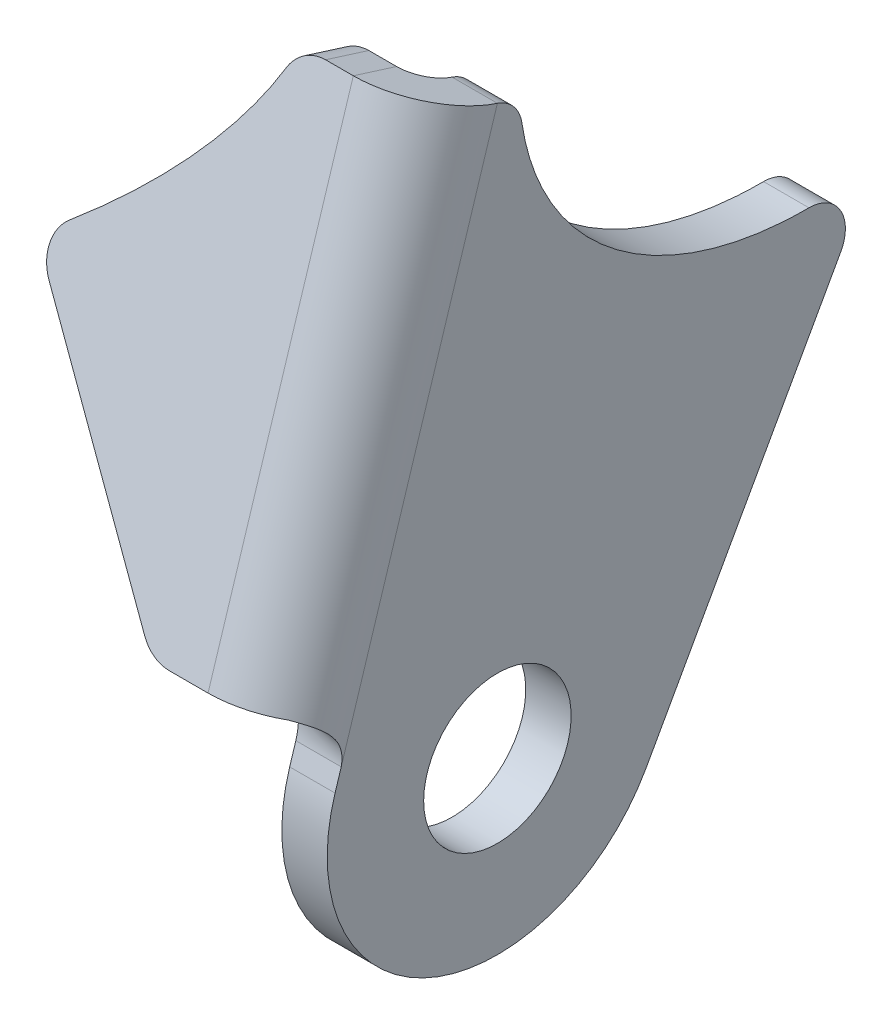
ISO-10303-21;
HEADER;
FILE_DESCRIPTION(('STEP AP214'),'2;1');
FILE_NAME('part.step','',(''),(''),'','','');
FILE_SCHEMA(('AUTOMOTIVE_DESIGN { 1 0 10303 214 1 1 1 1 }'));
ENDSEC;
DATA;
#1=APPLICATION_CONTEXT('core data for automotive mechanical design processes');
#2=APPLICATION_PROTOCOL_DEFINITION('international standard','automotive_design',2000,#1);
#3=PRODUCT_CONTEXT('',#1,'mechanical');
#4=PRODUCT('Part','Part','',(#3));
#5=PRODUCT_RELATED_PRODUCT_CATEGORY('part','',(#4));
#6=PRODUCT_DEFINITION_FORMATION('','',#4);
#7=PRODUCT_DEFINITION_CONTEXT('part definition',#1,'design');
#8=PRODUCT_DEFINITION('design','',#6,#7);
#9=PRODUCT_DEFINITION_SHAPE('','',#8);
#10=(LENGTH_UNIT() NAMED_UNIT(*) SI_UNIT(.MILLI.,.METRE.));
#11=(NAMED_UNIT(*) PLANE_ANGLE_UNIT() SI_UNIT($,.RADIAN.));
#12=(NAMED_UNIT(*) SI_UNIT($,.STERADIAN.) SOLID_ANGLE_UNIT());
#13=UNCERTAINTY_MEASURE_WITH_UNIT(LENGTH_MEASURE(1.E-05),#10,'distance_accuracy_value','');
#14=(GEOMETRIC_REPRESENTATION_CONTEXT(3) GLOBAL_UNCERTAINTY_ASSIGNED_CONTEXT((#13)) GLOBAL_UNIT_ASSIGNED_CONTEXT((#10,
#11,#12)) REPRESENTATION_CONTEXT('',''));
#15=CARTESIAN_POINT('',(0.,0.,0.));
#16=DIRECTION('',(0.,0.,1.));
#17=DIRECTION('',(1.,0.,0.));
#18=AXIS2_PLACEMENT_3D('',#15,#16,#17);
#19=CARTESIAN_POINT('',(472.519375,274.953876558,153.162384053848));
#20=DIRECTION('',(0.,-0.953939201416946,0.300000000000001));
#21=DIRECTION('',(0.,0.300000000000001,0.953939201416946));
#22=AXIS2_PLACEMENT_3D('',#19,#20,#21);
#23=PLANE('',#22);
#24=DIRECTION('',(1.,0.,0.));
#25=VECTOR('',#24,1.);
#26=CARTESIAN_POINT('',(1.66533453693773E-12,274.953876558001,153.162384053851));
#27=LINE('',#26,#25);
#28=CARTESIAN_POINT('',(469.380261929001,274.953876558,153.162384053848));
#29=VERTEX_POINT('',#28);
#30=CARTESIAN_POINT('',(470.931875,274.953876558,153.162384053848));
#31=VERTEX_POINT('',#30);
#32=EDGE_CURVE('E200',#29,#31,#27,.T.);
#33=ORIENTED_EDGE('',*,*,#32,.T.);
#34=DIRECTION('',(0.,0.300000000000001,0.953939201416946));
#35=VECTOR('',#34,1.);
#36=CARTESIAN_POINT('',(470.931875,274.953876558,153.162384053848));
#37=LINE('',#36,#35);
#38=CARTESIAN_POINT('',(470.931875,274.191876558,150.739378482249));
#39=VERTEX_POINT('',#38);
#40=EDGE_CURVE('E11',#39,#31,#37,.T.);
#41=ORIENTED_EDGE('',*,*,#40,.F.);
#42=DIRECTION('',(-1.,0.,0.));
#43=VECTOR('',#42,1.);
#44=CARTESIAN_POINT('',(472.519375,274.191876558,150.739378482249));
#45=LINE('',#44,#43);
#46=CARTESIAN_POINT('',(469.380261929001,274.191876558,150.739378482249));
#47=VERTEX_POINT('',#46);
#48=EDGE_CURVE('E173',#47,#39,#45,.F.);
#49=ORIENTED_EDGE('',*,*,#48,.F.);
#50=DIRECTION('',(0.,0.300000000000001,0.953939201416946));
#51=VECTOR('',#50,1.);
#52=CARTESIAN_POINT('',(469.380261929001,274.191876558,150.739378482249));
#53=LINE('',#52,#51);
#54=EDGE_CURVE('E176',#29,#47,#53,.F.);
#55=ORIENTED_EDGE('',*,*,#54,.F.);
#56=EDGE_LOOP('',(#33,#41,#49,#55));
#57=FACE_BOUND('',#56,.T.);
#58=ADVANCED_FACE('F41',(#57),#23,.F.);
#59=CARTESIAN_POINT('',(447.119375,274.953876558,153.162384053848));
#60=DIRECTION('',(0.795628229877527,0.577882258801892,-0.181735562793793));
#61=DIRECTION('',(-0.587668443577206,0.809101847991676,0.));
#62=AXIS2_PLACEMENT_3D('',#59,#60,#61);
#63=PLANE('',#62);
#64=DIRECTION('',(-0.605785209312635,0.758980958234147,-0.238688468963255));
#65=VECTOR('',#64,1.);
#66=CARTESIAN_POINT('',(387.309206328094,349.889313133379,129.596279485317));
#67=LINE('',#66,#65);
#68=CARTESIAN_POINT('',(467.146965918821,249.861550246608,161.053555610942));
#69=VERTEX_POINT('',#68);
#70=CARTESIAN_POINT('',(458.309753270916,260.933587035416,157.571561127741));
#71=VERTEX_POINT('',#70);
#72=EDGE_CURVE('E237',#69,#71,#67,.T.);
#73=ORIENTED_EDGE('',*,*,#72,.T.);
#74=DIRECTION('',(0.,0.3,0.953939201416946));
#75=VECTOR('',#74,1.);
#76=CARTESIAN_POINT('',(458.309753270916,260.933587035416,157.571561127741));
#77=LINE('',#76,#75);
#78=CARTESIAN_POINT('',(458.309753270916,260.171587035416,155.148555556142));
#79=VERTEX_POINT('',#78);
#80=EDGE_CURVE('E196',#79,#71,#77,.T.);
#81=ORIENTED_EDGE('',*,*,#80,.F.);
#82=DIRECTION('',(0.605785209312635,-0.758980958234147,0.238688468963255));
#83=VECTOR('',#82,1.);
#84=CARTESIAN_POINT('',(447.119375,274.191876558,150.739378482249));
#85=LINE('',#84,#83);
#86=CARTESIAN_POINT('',(467.146965918821,249.099550246607,158.630550039343));
#87=VERTEX_POINT('',#86);
#88=EDGE_CURVE('E187',#87,#79,#85,.F.);
#89=ORIENTED_EDGE('',*,*,#88,.F.);
#90=DIRECTION('',(0.,-0.300000000000001,-0.953939201416945));
#91=VECTOR('',#90,1.);
#92=CARTESIAN_POINT('',(467.146965918821,249.861550246607,161.053555610942));
#93=LINE('',#92,#91);
#94=EDGE_CURVE('E199',#69,#87,#93,.T.);
#95=ORIENTED_EDGE('',*,*,#94,.F.);
#96=EDGE_LOOP('',(#73,#81,#89,#95));
#97=FACE_BOUND('',#96,.T.);
#98=ADVANCED_FACE('F260',(#97),#63,.F.);
#99=CARTESIAN_POINT('',(467.756875,249.097402539214,161.293868947345));
#100=DIRECTION('',(0.,0.953939201416946,-0.300000000000001));
#101=DIRECTION('',(0.,-0.300000000000001,-0.953939201416946));
#102=AXIS2_PLACEMENT_3D('',#99,#100,#101);
#103=PLANE('',#102);
#104=DIRECTION('',(1.,0.,0.));
#105=VECTOR('',#104,1.);
#106=CARTESIAN_POINT('',(467.756875,248.335402539214,158.870863375746));
#107=LINE('',#106,#105);
#108=CARTESIAN_POINT('',(470.931875,248.335402539214,158.870863375746));
#109=VERTEX_POINT('',#108);
#110=CARTESIAN_POINT('',(468.763682481932,248.335402539214,158.870863375746));
#111=VERTEX_POINT('',#110);
#112=EDGE_CURVE('E171',#109,#111,#107,.F.);
#113=ORIENTED_EDGE('',*,*,#112,.F.);
#114=DIRECTION('',(0.,0.300000000000001,0.953939201416946));
#115=VECTOR('',#114,1.);
#116=CARTESIAN_POINT('',(470.931875,248.335402539214,158.870863375746));
#117=LINE('',#116,#115);
#118=CARTESIAN_POINT('',(470.931875,249.097402539214,161.293868947345));
#119=VERTEX_POINT('',#118);
#120=EDGE_CURVE('E175',#109,#119,#117,.T.);
#121=ORIENTED_EDGE('',*,*,#120,.T.);
#122=DIRECTION('',(-1.,0.,0.));
#123=VECTOR('',#122,1.);
#124=CARTESIAN_POINT('',(9.99200722162641E-13,249.097402539214,161.293868947347));
#125=LINE('',#124,#123);
#126=CARTESIAN_POINT('',(468.763682481932,249.097402539214,161.293868947345));
#127=VERTEX_POINT('',#126);
#128=EDGE_CURVE('E229',#119,#127,#125,.T.);
#129=ORIENTED_EDGE('',*,*,#128,.T.);
#130=DIRECTION('',(0.,-0.300000000000001,-0.953939201416945));
#131=VECTOR('',#130,1.);
#132=CARTESIAN_POINT('',(468.763682481932,249.097402539214,161.293868947345));
#133=LINE('',#132,#131);
#134=EDGE_CURVE('E186',#111,#127,#133,.F.);
#135=ORIENTED_EDGE('',*,*,#134,.F.);
#136=EDGE_LOOP('',(#113,#121,#129,#135));
#137=FACE_BOUND('',#136,.T.);
#138=ADVANCED_FACE('F184',(#137),#103,.F.);
#139=CARTESIAN_POINT('',(1.33226762955019E-12,68.578129589654,218.064553918074));
#140=DIRECTION('',(0.,-0.300000000000001,-0.953939201416946));
#141=DIRECTION('',(0.,-0.953939201416946,0.300000000000001));
#142=AXIS2_PLACEMENT_3D('',#139,#140,#141);
#143=PLANE('',#142);
#144=ORIENTED_EDGE('',*,*,#128,.F.);
#145=DIRECTION('',(0.,0.953939201416946,-0.300000000000001));
#146=VECTOR('',#145,1.);
#147=CARTESIAN_POINT('',(470.931875,274.953876558,153.162384053848));
#148=LINE('',#147,#146);
#149=EDGE_CURVE('E49',#119,#31,#148,.T.);
#150=ORIENTED_EDGE('',*,*,#149,.T.);
#151=ORIENTED_EDGE('',*,*,#32,.F.);
#152=CARTESIAN_POINT('',(469.380261929001,273.015472100721,153.771984053848));
#153=DIRECTION('',(0.,0.300000000000001,0.953939201416946));
#154=DIRECTION('',(0.953939201416945,0.286181760425085,-0.0900000000000061));
#155=AXIS2_PLACEMENT_3D('',#152,#153,#154);
#156=CIRCLE('',#155,2.032);
#157=CARTESIAN_POINT('',(467.532869233194,273.822757333464,153.51810459333));
#158=VERTEX_POINT('',#157);
#159=EDGE_CURVE('E211',#158,#29,#156,.F.);
#160=ORIENTED_EDGE('',*,*,#159,.F.);
#161=CARTESIAN_POINT('',(433.841055893317,266.765989850092,155.737355298058));
#162=DIRECTION('',(0.,0.300000000000001,0.953939201416946));
#163=DIRECTION('',(0.91475563366351,0.385398675295584,-0.121202276221528));
#164=AXIS2_PLACEMENT_3D('',#161,#162,#163);
#165=ELLIPSE('',#164,37.4703983980415,15.875);
#166=CARTESIAN_POINT('',(458.615876339165,263.589176127829,156.736416994299));
#167=VERTEX_POINT('',#166);
#168=EDGE_CURVE('E188',#167,#158,#165,.T.);
#169=ORIENTED_EDGE('',*,*,#168,.F.);
#170=CARTESIAN_POINT('',(459.926469834027,262.107843785302,157.202274464144));
#171=DIRECTION('',(0.,0.300000000000001,0.953939201416946));
#172=DIRECTION('',(0.953939201416945,0.286181760425085,-0.0900000000000061));
#173=AXIS2_PLACEMENT_3D('',#170,#171,#172);
#174=CIRCLE('',#173,2.032);
#175=EDGE_CURVE('E213',#71,#167,#174,.F.);
#176=ORIENTED_EDGE('',*,*,#175,.F.);
#177=ORIENTED_EDGE('',*,*,#72,.F.);
#178=CARTESIAN_POINT('',(468.763682481932,251.035806996493,160.684268947345));
#179=DIRECTION('',(0.,0.300000000000001,0.953939201416946));
#180=DIRECTION('',(0.953939201416945,0.286181760425085,-0.0900000000000061));
#181=AXIS2_PLACEMENT_3D('',#178,#179,#180);
#182=CIRCLE('',#181,2.032);
#183=EDGE_CURVE('E216',#127,#69,#182,.F.);
#184=ORIENTED_EDGE('',*,*,#183,.F.);
#185=EDGE_LOOP('',(#144,#150,#151,#160,#169,#176,#177,#184));
#186=FACE_BOUND('',#185,.T.);
#187=ADVANCED_FACE('F226',(#186),#143,.F.);
#188=CARTESIAN_POINT('',(1.33226762955019E-12,67.8161295896539,215.641548346475));
#189=DIRECTION('',(0.,-0.300000000000001,-0.953939201416946));
#190=DIRECTION('',(0.,-0.953939201416946,0.300000000000001));
#191=AXIS2_PLACEMENT_3D('',#188,#189,#190);
#192=PLANE('',#191);
#193=ORIENTED_EDGE('',*,*,#88,.T.);
#194=CARTESIAN_POINT('',(459.926469834027,261.345843785302,154.779268892545));
#195=DIRECTION('',(0.,0.300000000000001,0.953939201416946));
#196=DIRECTION('',(0.953939201416945,0.286181760425085,-0.0900000000000061));
#197=AXIS2_PLACEMENT_3D('',#194,#195,#196);
#198=CIRCLE('',#197,2.032);
#199=CARTESIAN_POINT('',(458.615876339165,262.827176127829,154.3134114227));
#200=VERTEX_POINT('',#199);
#201=EDGE_CURVE('E206',#200,#79,#198,.T.);
#202=ORIENTED_EDGE('',*,*,#201,.F.);
#203=CARTESIAN_POINT('',(433.841055893317,266.003989850092,153.314349726459));
#204=DIRECTION('',(0.,0.300000000000001,0.953939201416946));
#205=DIRECTION('',(0.91475563366351,0.385398675295584,-0.121202276221528));
#206=AXIS2_PLACEMENT_3D('',#203,#204,#205);
#207=ELLIPSE('',#206,37.4703983980415,15.875);
#208=CARTESIAN_POINT('',(467.532869233194,273.060757333464,151.095099021731));
#209=VERTEX_POINT('',#208);
#210=EDGE_CURVE('E192',#200,#209,#207,.T.);
#211=ORIENTED_EDGE('',*,*,#210,.T.);
#212=CARTESIAN_POINT('',(469.380261929001,272.253472100721,151.348978482249));
#213=DIRECTION('',(0.,0.300000000000001,0.953939201416946));
#214=DIRECTION('',(0.953939201416945,0.286181760425085,-0.0900000000000061));
#215=AXIS2_PLACEMENT_3D('',#212,#213,#214);
#216=CIRCLE('',#215,2.032);
#217=EDGE_CURVE('E203',#47,#209,#216,.T.);
#218=ORIENTED_EDGE('',*,*,#217,.F.);
#219=ORIENTED_EDGE('',*,*,#48,.T.);
#220=DIRECTION('',(0.,-0.953939201416946,0.300000000000001));
#221=VECTOR('',#220,1.);
#222=CARTESIAN_POINT('',(470.931875,274.191876558,150.739378482249));
#223=LINE('',#222,#221);
#224=EDGE_CURVE('E160',#39,#109,#223,.T.);
#225=ORIENTED_EDGE('',*,*,#224,.T.);
#226=ORIENTED_EDGE('',*,*,#112,.T.);
#227=CARTESIAN_POINT('',(468.763682481932,250.273806996493,158.261263375746));
#228=DIRECTION('',(0.,0.300000000000001,0.953939201416946));
#229=DIRECTION('',(0.953939201416945,0.286181760425085,-0.0900000000000061));
#230=AXIS2_PLACEMENT_3D('',#227,#228,#229);
#231=CIRCLE('',#230,2.032);
#232=EDGE_CURVE('E208',#87,#111,#231,.T.);
#233=ORIENTED_EDGE('',*,*,#232,.F.);
#234=EDGE_LOOP('',(#193,#202,#211,#218,#219,#225,#226,#233));
#235=FACE_BOUND('',#234,.T.);
#236=ADVANCED_FACE('F169',(#235),#192,.T.);
#237=CARTESIAN_POINT('',(433.841055893317,266.003989850092,153.314349726459));
#238=DIRECTION('',(0.,0.300000000000001,0.953939201416946));
#239=DIRECTION('',(0.91475563366351,0.385398675295584,-0.121202276221528));
#240=AXIS2_PLACEMENT_3D('',#237,#238,#239);
#241=ELLIPSE('',#240,37.4703983980415,15.875);
#242=DIRECTION('',(0.,-0.300000000000001,-0.953939201416946));
#243=VECTOR('',#242,1.);
#244=SURFACE_OF_LINEAR_EXTRUSION('',#241,#243);
#245=ORIENTED_EDGE('',*,*,#168,.T.);
#246=DIRECTION('',(0.,-0.300000000000001,-0.953939201416946));
#247=VECTOR('',#246,1.);
#248=CARTESIAN_POINT('',(467.532869233194,273.060757333464,151.095099021731));
#249=LINE('',#248,#247);
#250=EDGE_CURVE('E218',#209,#158,#249,.F.);
#251=ORIENTED_EDGE('',*,*,#250,.F.);
#252=ORIENTED_EDGE('',*,*,#210,.F.);
#253=DIRECTION('',(0.,-0.300000000000001,-0.953939201416946));
#254=VECTOR('',#253,1.);
#255=CARTESIAN_POINT('',(458.615876339165,263.589176127829,156.736416994299));
#256=LINE('',#255,#254);
#257=EDGE_CURVE('E220',#167,#200,#256,.T.);
#258=ORIENTED_EDGE('',*,*,#257,.F.);
#259=EDGE_LOOP('',(#245,#251,#252,#258));
#260=FACE_BOUND('',#259,.T.);
#261=ADVANCED_FACE('F246',(#260),#244,.T.);
#262=CARTESIAN_POINT('',(468.763682481932,251.035806996493,160.684268947345));
#263=DIRECTION('',(0.,-0.300000000000001,-0.953939201416945));
#264=DIRECTION('',(0.953939201416945,0.286181760425085,-0.0900000000000042));
#265=AXIS2_PLACEMENT_3D('',#262,#263,#264);
#266=CYLINDRICAL_SURFACE('',#265,2.032);
#267=ORIENTED_EDGE('',*,*,#183,.T.);
#268=ORIENTED_EDGE('',*,*,#94,.T.);
#269=ORIENTED_EDGE('',*,*,#232,.T.);
#270=ORIENTED_EDGE('',*,*,#134,.T.);
#271=EDGE_LOOP('',(#267,#268,#269,#270));
#272=FACE_BOUND('',#271,.T.);
#273=ADVANCED_FACE('F250',(#272),#266,.T.);
#274=CARTESIAN_POINT('',(459.926469834027,261.726843785302,155.990771678345));
#275=DIRECTION('',(0.,-0.300000000000001,-0.953939201416946));
#276=DIRECTION('',(0.953939201416945,0.286181760425085,-0.0900000000000061));
#277=AXIS2_PLACEMENT_3D('',#274,#275,#276);
#278=CYLINDRICAL_SURFACE('',#277,2.032);
#279=ORIENTED_EDGE('',*,*,#201,.T.);
#280=ORIENTED_EDGE('',*,*,#80,.T.);
#281=ORIENTED_EDGE('',*,*,#175,.T.);
#282=ORIENTED_EDGE('',*,*,#257,.T.);
#283=EDGE_LOOP('',(#279,#280,#281,#282));
#284=FACE_BOUND('',#283,.T.);
#285=ADVANCED_FACE('F267',(#284),#278,.T.);
#286=CARTESIAN_POINT('',(469.380261929001,272.634472100721,152.560481268049));
#287=DIRECTION('',(0.,-0.300000000000001,-0.953939201416946));
#288=DIRECTION('',(0.953939201416945,0.286181760425085,-0.0900000000000061));
#289=AXIS2_PLACEMENT_3D('',#286,#287,#288);
#290=CYLINDRICAL_SURFACE('',#289,2.032);
#291=ORIENTED_EDGE('',*,*,#217,.T.);
#292=ORIENTED_EDGE('',*,*,#250,.T.);
#293=ORIENTED_EDGE('',*,*,#159,.T.);
#294=ORIENTED_EDGE('',*,*,#54,.T.);
#295=EDGE_LOOP('',(#291,#292,#293,#294));
#296=FACE_BOUND('',#295,.T.);
#297=ADVANCED_FACE('F43',(#296),#290,.T.);
#298=CARTESIAN_POINT('',(473.789375,257.900051140314,131.779385802766));
#299=DIRECTION('',(-1.,0.,0.));
#300=DIRECTION('',(0.,0.,-1.));
#301=AXIS2_PLACEMENT_3D('',#298,#299,#300);
#302=CYLINDRICAL_SURFACE('',#301,2.032);
#303=CARTESIAN_POINT('',(472.519375,257.900051140314,131.779385802766));
#304=DIRECTION('',(1.,0.,0.));
#305=DIRECTION('',(0.,0.,-1.));
#306=AXIS2_PLACEMENT_3D('',#303,#304,#305);
#307=CIRCLE('',#306,2.032);
#308=CARTESIAN_POINT('',(472.519375,256.911736933325,130.00392557278));
#309=VERTEX_POINT('',#308);
#310=CARTESIAN_POINT('',(472.519375,259.932034390258,131.787636375182));
#311=VERTEX_POINT('',#310);
#312=EDGE_CURVE('E314',#309,#311,#307,.T.);
#313=ORIENTED_EDGE('',*,*,#312,.T.);
#314=DIRECTION('',(-1.,0.,0.));
#315=VECTOR('',#314,1.);
#316=CARTESIAN_POINT('',(472.519375,259.932034390258,131.787636375182));
#317=LINE('',#316,#315);
#318=CARTESIAN_POINT('',(475.059375,259.932034390258,131.787636375182));
#319=VERTEX_POINT('',#318);
#320=EDGE_CURVE('E328',#311,#319,#317,.F.);
#321=ORIENTED_EDGE('',*,*,#320,.T.);
#322=CARTESIAN_POINT('',(475.059375,257.900051140314,131.779385802766));
#323=DIRECTION('',(1.,0.,0.));
#324=DIRECTION('',(0.,0.,-1.));
#325=AXIS2_PLACEMENT_3D('',#322,#323,#324);
#326=CIRCLE('',#325,2.032);
#327=CARTESIAN_POINT('',(475.059375,256.911736933325,130.00392557278));
#328=VERTEX_POINT('',#327);
#329=EDGE_CURVE('E302',#319,#328,#326,.F.);
#330=ORIENTED_EDGE('',*,*,#329,.T.);
#331=DIRECTION('',(-1.,0.,0.));
#332=VECTOR('',#331,1.);
#333=CARTESIAN_POINT('',(472.519375,256.911736933325,130.00392557278));
#334=LINE('',#333,#332);
#335=EDGE_CURVE('E347',#328,#309,#334,.T.);
#336=ORIENTED_EDGE('',*,*,#335,.T.);
#337=EDGE_LOOP('',(#313,#321,#330,#336));
#338=FACE_BOUND('',#337,.T.);
#339=ADVANCED_FACE('F274',(#338),#302,.T.);
#340=CARTESIAN_POINT('',(472.519375,273.715626558,120.65));
#341=DIRECTION('',(0.,-0.486375101864288,-0.873750113182541));
#342=DIRECTION('',(0.,-0.873750113182541,0.486375101864288));
#343=AXIS2_PLACEMENT_3D('',#340,#341,#342);
#344=PLANE('',#343);
#345=DIRECTION('',(0.,-0.873750113182541,0.486375101864288));
#346=VECTOR('',#345,1.);
#347=CARTESIAN_POINT('',(475.059375,273.715626558,120.65));
#348=LINE('',#347,#346);
#349=CARTESIAN_POINT('',(475.059375,237.332903712743,140.902530171936));
#350=VERTEX_POINT('',#349);
#351=EDGE_CURVE('E292',#328,#350,#348,.T.);
#352=ORIENTED_EDGE('',*,*,#351,.T.);
#353=DIRECTION('',(1.,0.,0.));
#354=VECTOR('',#353,1.);
#355=CARTESIAN_POINT('',(472.519375,237.332903712743,140.902530171936));
#356=LINE('',#355,#354);
#357=CARTESIAN_POINT('',(472.519375,237.332903712743,140.902530171936));
#358=VERTEX_POINT('',#357);
#359=EDGE_CURVE('E341',#358,#350,#356,.T.);
#360=ORIENTED_EDGE('',*,*,#359,.F.);
#361=DIRECTION('',(0.,-0.873750113182541,0.486375101864288));
#362=VECTOR('',#361,1.);
#363=CARTESIAN_POINT('',(472.519375,273.715626558,120.65));
#364=LINE('',#363,#362);
#365=EDGE_CURVE('E344',#309,#358,#364,.T.);
#366=ORIENTED_EDGE('',*,*,#365,.F.);
#367=ORIENTED_EDGE('',*,*,#335,.F.);
#368=EDGE_LOOP('',(#352,#360,#366,#367));
#369=FACE_BOUND('',#368,.T.);
#370=ADVANCED_FACE('F401',(#369),#344,.T.);
#371=CARTESIAN_POINT('',(472.519375,241.965626558,149.225));
#372=DIRECTION('',(1.,0.,0.));
#373=DIRECTION('',(0.,0.,1.));
#374=AXIS2_PLACEMENT_3D('',#371,#372,#373);
#375=CYLINDRICAL_SURFACE('',#374,9.52500000000001);
#376=CARTESIAN_POINT('',(475.059375,241.965626558,149.225));
#377=DIRECTION('',(-1.,0.,0.));
#378=DIRECTION('',(0.,0.,-1.));
#379=AXIS2_PLACEMENT_3D('',#376,#377,#378);
#380=CIRCLE('',#379,9.52500000000001);
#381=CARTESIAN_POINT('',(475.059375,244.823126558,158.311270893496));
#382=VERTEX_POINT('',#381);
#383=EDGE_CURVE('E286',#350,#382,#380,.T.);
#384=ORIENTED_EDGE('',*,*,#383,.T.);
#385=DIRECTION('',(1.,0.,0.));
#386=VECTOR('',#385,1.);
#387=CARTESIAN_POINT('',(472.519375,244.823126558,158.311270893496));
#388=LINE('',#387,#386);
#389=CARTESIAN_POINT('',(472.519375,244.823126558,158.311270893496));
#390=VERTEX_POINT('',#389);
#391=EDGE_CURVE('E336',#390,#382,#388,.T.);
#392=ORIENTED_EDGE('',*,*,#391,.F.);
#393=CARTESIAN_POINT('',(472.519375,241.965626558,149.225));
#394=DIRECTION('',(-1.,0.,0.));
#395=DIRECTION('',(0.,0.,-1.));
#396=AXIS2_PLACEMENT_3D('',#393,#394,#395);
#397=CIRCLE('',#396,9.52500000000001);
#398=EDGE_CURVE('E338',#358,#390,#397,.T.);
#399=ORIENTED_EDGE('',*,*,#398,.F.);
#400=ORIENTED_EDGE('',*,*,#359,.T.);
#401=EDGE_LOOP('',(#384,#392,#399,#400));
#402=FACE_BOUND('',#401,.T.);
#403=ADVANCED_FACE('F395',(#402),#375,.T.);
#404=CARTESIAN_POINT('',(472.519375,276.366759756375,129.324113696996));
#405=DIRECTION('',(1.,0.,0.));
#406=DIRECTION('',(0.,0.396544052208595,-0.91801569412401));
#407=AXIS2_PLACEMENT_3D('',#404,#405,#406);
#408=ELLIPSE('',#407,19.1587804270777,15.875);
#409=DIRECTION('',(-1.,0.,0.));
#410=VECTOR('',#409,1.);
#411=SURFACE_OF_LINEAR_EXTRUSION('',#408,#410);
#412=CARTESIAN_POINT('',(475.059375,276.366759756375,129.324113696996));
#413=DIRECTION('',(1.,0.,0.));
#414=DIRECTION('',(0.,0.396544052208595,-0.91801569412401));
#415=AXIS2_PLACEMENT_3D('',#412,#413,#414);
#416=ELLIPSE('',#415,19.1587804270777,15.875);
#417=CARTESIAN_POINT('',(475.059375,272.085989306741,147.855143440128));
#418=VERTEX_POINT('',#417);
#419=EDGE_CURVE('E305',#418,#319,#416,.T.);
#420=ORIENTED_EDGE('',*,*,#419,.T.);
#421=ORIENTED_EDGE('',*,*,#320,.F.);
#422=CARTESIAN_POINT('',(472.519375,276.366759756375,129.324113696996));
#423=DIRECTION('',(1.,0.,0.));
#424=DIRECTION('',(0.,0.396544052208595,-0.91801569412401));
#425=AXIS2_PLACEMENT_3D('',#422,#423,#424);
#426=ELLIPSE('',#425,19.1587804270777,15.875);
#427=CARTESIAN_POINT('',(472.519375,272.085989306741,147.855143440128));
#428=VERTEX_POINT('',#427);
#429=EDGE_CURVE('E331',#428,#311,#426,.T.);
#430=ORIENTED_EDGE('',*,*,#429,.F.);
#431=DIRECTION('',(-1.,0.,0.));
#432=VECTOR('',#431,1.);
#433=CARTESIAN_POINT('',(475.059375,272.085989306741,147.855143440128));
#434=LINE('',#433,#432);
#435=EDGE_CURVE('E333',#418,#428,#434,.T.);
#436=ORIENTED_EDGE('',*,*,#435,.F.);
#437=EDGE_LOOP('',(#420,#421,#430,#436));
#438=FACE_BOUND('',#437,.T.);
#439=ADVANCED_FACE('F388',(#438),#411,.T.);
#440=CARTESIAN_POINT('',(472.519375,241.965626558,149.225));
#441=DIRECTION('',(1.,0.,0.));
#442=DIRECTION('',(0.,0.,1.));
#443=AXIS2_PLACEMENT_3D('',#440,#441,#442);
#444=CYLINDRICAL_SURFACE('',#443,4.1275);
#445=CARTESIAN_POINT('',(472.519375,241.965626558,149.225));
#446=DIRECTION('',(-1.,0.,0.));
#447=DIRECTION('',(0.,0.,1.));
#448=AXIS2_PLACEMENT_3D('',#445,#446,#447);
#449=CIRCLE('',#448,4.1275);
#450=CARTESIAN_POINT('',(472.519375,241.965626558,153.3525));
#451=VERTEX_POINT('',#450);
#452=EDGE_CURVE('E322',#451,#451,#449,.T.);
#453=ORIENTED_EDGE('',*,*,#452,.T.);
#454=EDGE_LOOP('',(#453));
#455=FACE_BOUND('',#454,.T.);
#456=CARTESIAN_POINT('',(475.059375,241.965626558,149.225));
#457=DIRECTION('',(-1.,0.,0.));
#458=DIRECTION('',(0.,0.,1.));
#459=AXIS2_PLACEMENT_3D('',#456,#457,#458);
#460=CIRCLE('',#459,4.1275);
#461=CARTESIAN_POINT('',(475.059375,241.965626558,153.3525));
#462=VERTEX_POINT('',#461);
#463=EDGE_CURVE('E325',#462,#462,#460,.T.);
#464=ORIENTED_EDGE('',*,*,#463,.F.);
#465=EDGE_LOOP('',(#464));
#466=FACE_BOUND('',#465,.T.);
#467=ADVANCED_FACE('F386',(#455,#466),#444,.F.);
#468=CARTESIAN_POINT('',(472.519375,241.965626558,149.225));
#469=DIRECTION('',(-1.,0.,0.));
#470=DIRECTION('',(0.,0.,-1.));
#471=AXIS2_PLACEMENT_3D('',#468,#469,#470);
#472=PLANE('',#471);
#473=ORIENTED_EDGE('',*,*,#452,.F.);
#474=EDGE_LOOP('',(#473));
#475=FACE_BOUND('',#474,.T.);
#476=ORIENTED_EDGE('',*,*,#429,.T.);
#477=ORIENTED_EDGE('',*,*,#312,.F.);
#478=ORIENTED_EDGE('',*,*,#365,.T.);
#479=ORIENTED_EDGE('',*,*,#398,.T.);
#480=DIRECTION('',(0.,0.953939201416945,-0.300000000000001));
#481=VECTOR('',#480,1.);
#482=CARTESIAN_POINT('',(472.519375,244.823126558,158.311270893496));
#483=LINE('',#482,#481);
#484=CARTESIAN_POINT('',(472.519375,245.920748081935,157.966084893496));
#485=VERTEX_POINT('',#484);
#486=EDGE_CURVE('E310',#390,#485,#483,.T.);
#487=ORIENTED_EDGE('',*,*,#486,.T.);
#488=DIRECTION('',(0.,0.953939201416945,-0.300000000000003));
#489=VECTOR('',#488,1.);
#490=CARTESIAN_POINT('',(472.519375,247.859152539214,157.356484893496));
#491=LINE('',#490,#489);
#492=CARTESIAN_POINT('',(472.519375,273.715626558,149.225));
#493=VERTEX_POINT('',#492);
#494=EDGE_CURVE('E352',#485,#493,#491,.T.);
#495=ORIENTED_EDGE('',*,*,#494,.T.);
#496=CARTESIAN_POINT('',(472.519375,271.787057313123,149.865034895702));
#497=DIRECTION('',(1.,0.,0.));
#498=DIRECTION('',(0.,0.,-1.));
#499=AXIS2_PLACEMENT_3D('',#496,#497,#498);
#500=CIRCLE('',#499,2.032);
#501=EDGE_CURVE('E319',#428,#493,#500,.T.);
#502=ORIENTED_EDGE('',*,*,#501,.F.);
#503=EDGE_LOOP('',(#476,#477,#478,#479,#487,#495,#502));
#504=FACE_BOUND('',#503,.T.);
#505=ADVANCED_FACE('F373',(#475,#504),#472,.T.);
#506=CARTESIAN_POINT('',(472.519375,244.823126558,158.311270893496));
#507=DIRECTION('',(0.,0.3,0.953939201416945));
#508=DIRECTION('',(0.,0.953939201416946,-0.300000000000001));
#509=AXIS2_PLACEMENT_3D('',#506,#507,#508);
#510=PLANE('',#509);
#511=ORIENTED_EDGE('',*,*,#486,.F.);
#512=ORIENTED_EDGE('',*,*,#391,.T.);
#513=DIRECTION('',(0.,0.953939201416945,-0.300000000000001));
#514=VECTOR('',#513,1.);
#515=CARTESIAN_POINT('',(475.059375,244.823126558,158.311270893496));
#516=LINE('',#515,#514);
#517=CARTESIAN_POINT('',(475.059375,245.920750825387,157.96608403072));
#518=VERTEX_POINT('',#517);
#519=EDGE_CURVE('E284',#382,#518,#516,.T.);
#520=ORIENTED_EDGE('',*,*,#519,.T.);
#521=CARTESIAN_POINT('',(472.519375,245.920748081935,157.966084893496));
#522=CARTESIAN_POINT('',(475.059375,245.920748081934,157.966084893496));
#523=B_SPLINE_CURVE_WITH_KNOTS('',1,(#521,#522),.UNSPECIFIED.,.F.,.F.,(2,2),(0.,1.),.UNSPECIFIED.);
#524=EDGE_CURVE('E313',#485,#518,#523,.T.);
#525=ORIENTED_EDGE('',*,*,#524,.F.);
#526=EDGE_LOOP('',(#511,#512,#520,#525));
#527=FACE_BOUND('',#526,.T.);
#528=ADVANCED_FACE('F363',(#527),#510,.T.);
#529=CARTESIAN_POINT('',(475.059375,241.965626558,149.225));
#530=DIRECTION('',(-1.,0.,0.));
#531=DIRECTION('',(0.,0.,-1.));
#532=AXIS2_PLACEMENT_3D('',#529,#530,#531);
#533=PLANE('',#532);
#534=DIRECTION('',(0.,0.953939201416945,-0.300000000000003));
#535=VECTOR('',#534,1.);
#536=CARTESIAN_POINT('',(475.059375,247.859152539214,157.356484893496));
#537=LINE('',#536,#535);
#538=CARTESIAN_POINT('',(475.059375,273.715626558,149.225));
#539=VERTEX_POINT('',#538);
#540=EDGE_CURVE('E309',#518,#539,#537,.T.);
#541=ORIENTED_EDGE('',*,*,#540,.F.);
#542=ORIENTED_EDGE('',*,*,#519,.F.);
#543=ORIENTED_EDGE('',*,*,#383,.F.);
#544=ORIENTED_EDGE('',*,*,#351,.F.);
#545=ORIENTED_EDGE('',*,*,#329,.F.);
#546=ORIENTED_EDGE('',*,*,#419,.F.);
#547=CARTESIAN_POINT('',(475.059375,271.787057313123,149.865034895702));
#548=DIRECTION('',(1.,0.,0.));
#549=DIRECTION('',(0.,0.,-1.));
#550=AXIS2_PLACEMENT_3D('',#547,#548,#549);
#551=CIRCLE('',#550,2.032);
#552=EDGE_CURVE('E307',#539,#418,#551,.F.);
#553=ORIENTED_EDGE('',*,*,#552,.F.);
#554=EDGE_LOOP('',(#541,#542,#543,#544,#545,#546,#553));
#555=FACE_BOUND('',#554,.T.);
#556=ORIENTED_EDGE('',*,*,#463,.T.);
#557=EDGE_LOOP('',(#556));
#558=FACE_BOUND('',#557,.T.);
#559=ADVANCED_FACE('F372',(#555,#558),#533,.F.);
#560=CARTESIAN_POINT('',(473.789375,271.787057313123,149.865034895702));
#561=DIRECTION('',(-1.,0.,0.));
#562=DIRECTION('',(0.,0.,-1.));
#563=AXIS2_PLACEMENT_3D('',#560,#561,#562);
#564=CYLINDRICAL_SURFACE('',#563,2.032);
#565=ORIENTED_EDGE('',*,*,#501,.T.);
#566=DIRECTION('',(1.,0.,0.));
#567=VECTOR('',#566,1.);
#568=CARTESIAN_POINT('',(472.519375,273.715626558,149.225));
#569=LINE('',#568,#567);
#570=EDGE_CURVE('E350',#493,#539,#569,.T.);
#571=ORIENTED_EDGE('',*,*,#570,.T.);
#572=ORIENTED_EDGE('',*,*,#552,.T.);
#573=ORIENTED_EDGE('',*,*,#435,.T.);
#574=EDGE_LOOP('',(#565,#571,#572,#573));
#575=FACE_BOUND('',#574,.T.);
#576=ADVANCED_FACE('F252',(#575),#564,.T.);
#577=CARTESIAN_POINT('',(470.931875,247.859152539214,157.356484893496));
#578=DIRECTION('',(-3.57680980868252E-13,0.953939201416943,-0.300000000000009));
#579=DIRECTION('',(0.,-0.300000000000009,-0.953939201416943));
#580=AXIS2_PLACEMENT_3D('',#577,#578,#579);
#581=PLANE('',#580);
#582=ORIENTED_EDGE('',*,*,#120,.F.);
#583=CARTESIAN_POINT('',(470.931875,247.859152539214,157.356484893496));
#584=DIRECTION('',(-3.57680980868252E-13,0.953939201416943,-0.300000000000009));
#585=DIRECTION('',(0.,0.300000000000009,0.953939201416943));
#586=AXIS2_PLACEMENT_3D('',#583,#584,#585);
#587=CIRCLE('',#586,1.5875);
#588=CARTESIAN_POINT('',(472.134623972878,248.16998948078,158.344883372856));
#589=VERTEX_POINT('',#588);
#590=EDGE_CURVE('E156',#109,#589,#587,.T.);
#591=ORIENTED_EDGE('',*,*,#590,.T.);
#592=CARTESIAN_POINT('',(474.059022329482,248.667328587284,159.926320939831));
#593=CARTESIAN_POINT('',(472.134623972878,248.169989480779,158.344883372856));
#594=B_SPLINE_CURVE_WITH_KNOTS('',1,(#592,#593),.UNSPECIFIED.,.F.,.F.,(2,2),(0.,1.),.UNSPECIFIED.);
#595=CARTESIAN_POINT('',(474.059022329482,248.667328587284,159.926320939831));
#596=VERTEX_POINT('',#595);
#597=EDGE_CURVE('E431',#596,#589,#594,.T.);
#598=ORIENTED_EDGE('',*,*,#597,.F.);
#599=CARTESIAN_POINT('',(470.931875,247.859152539214,157.356484893496));
#600=DIRECTION('',(0.,0.953939201416945,-0.300000000000003));
#601=DIRECTION('',(0.,0.300000000000003,0.953939201416945));
#602=AXIS2_PLACEMENT_3D('',#599,#600,#601);
#603=CIRCLE('',#602,4.1275);
#604=EDGE_CURVE('E64',#119,#596,#603,.T.);
#605=ORIENTED_EDGE('',*,*,#604,.F.);
#606=EDGE_LOOP('',(#582,#591,#598,#605));
#607=FACE_BOUND('',#606,.T.);
#608=ADVANCED_FACE('F179',(#607),#581,.F.);
#609=CARTESIAN_POINT('',(474.059022329482,248.667328587284,159.926320939831));
#610=CARTESIAN_POINT('',(474.359604783633,248.514415798954,159.608641075787));
#611=CARTESIAN_POINT('',(474.564910349356,248.331599307031,159.294315580534));
#612=CARTESIAN_POINT('',(474.849565978607,247.928651620597,158.745716387849));
#613=CARTESIAN_POINT('',(474.929351405122,247.708596520095,158.511381184273));
#614=CARTESIAN_POINT('',(475.026154759362,247.241675667624,158.155556389392));
#615=CARTESIAN_POINT('',(475.043533150065,246.994607973843,158.033424664049));
#616=CARTESIAN_POINT('',(475.060107574097,246.476086434056,157.909716241873));
#617=CARTESIAN_POINT('',(475.059375,246.204504003049,157.907746331044));
#618=CARTESIAN_POINT('',(475.059375,245.920748081934,157.966084893496));
#619=CARTESIAN_POINT('',(472.134623972878,248.169989480779,158.344883372856));
#620=CARTESIAN_POINT('',(472.250219244734,248.081503128002,158.232047032497));
#621=CARTESIAN_POINT('',(472.329196288214,247.964158072246,158.125926920272));
#622=CARTESIAN_POINT('',(472.438679222541,247.680142308587,157.955507139037));
#623=CARTESIAN_POINT('',(472.469365925047,247.513544082014,157.89115396088));
#624=CARTESIAN_POINT('',(472.50659798437,247.135148425189,157.816821347465));
#625=CARTESIAN_POINT('',(472.513281980795,246.923273325009,157.806594937576));
#626=CARTESIAN_POINT('',(472.519656759268,246.45525642068,157.843481020787));
#627=CARTESIAN_POINT('',(472.519375,246.199066262781,157.890442095987));
#628=CARTESIAN_POINT('',(472.519375,245.920748081935,157.966084893496));
#629=B_SPLINE_SURFACE_WITH_KNOTS('',1,3,((#609,#610,#611,#612,#613,#614,#615,#616,#617,#618),
(#619,#620,#621,#622,#623,#624,#625,#626,#627,#628)),.UNSPECIFIED.,.F.,.F.,.F.,(2,2),(4,2,2,2,
4),(0.,1.),(0.,0.25,0.5,0.75,1.),.UNSPECIFIED.);
#630=CARTESIAN_POINT('',(472.134623972878,248.169989480779,158.344883372856));
#631=CARTESIAN_POINT('',(472.250219244734,248.081503128002,158.232047032497));
#632=CARTESIAN_POINT('',(472.329196288214,247.964158072246,158.125926920272));
#633=CARTESIAN_POINT('',(472.438679222541,247.680142308587,157.955507139037));
#634=CARTESIAN_POINT('',(472.469365925047,247.513544082014,157.89115396088));
#635=CARTESIAN_POINT('',(472.50659798437,247.135148425189,157.816821347465));
#636=CARTESIAN_POINT('',(472.513281980795,246.923273325009,157.806594937576));
#637=CARTESIAN_POINT('',(472.519656759268,246.45525642068,157.843481020787));
#638=CARTESIAN_POINT('',(472.519375,246.199066262781,157.890442095987));
#639=CARTESIAN_POINT('',(472.519375,245.920748081935,157.966084893496));
#640=B_SPLINE_CURVE_WITH_KNOTS('',3,(#630,#631,#632,#633,#634,#635,#636,#637,#638,#639),
.UNSPECIFIED.,.F.,.F.,(4,2,2,2,4),(0.,0.25,0.5,0.75,1.),.UNSPECIFIED.);
#641=EDGE_CURVE('E162',#589,#485,#640,.T.);
#642=CARTESIAN_POINT('',(475.059375,245.920748081934,157.966084893496));
#643=CARTESIAN_POINT('',(475.059375,246.204504003049,157.907746331044));
#644=CARTESIAN_POINT('',(475.060107574097,246.476086434056,157.909716241873));
#645=CARTESIAN_POINT('',(475.043533150065,246.994607973843,158.033424664049));
#646=CARTESIAN_POINT('',(475.026154759362,247.241675667624,158.155556389392));
#647=CARTESIAN_POINT('',(474.929351405122,247.708596520095,158.511381184273));
#648=CARTESIAN_POINT('',(474.849565978607,247.928651620597,158.745716387849));
#649=CARTESIAN_POINT('',(474.564910349356,248.331599307031,159.294315580534));
#650=CARTESIAN_POINT('',(474.359604783633,248.514415798954,159.608641075787));
#651=CARTESIAN_POINT('',(474.059022329482,248.667328587284,159.926320939831));
#652=B_SPLINE_CURVE_WITH_KNOTS('',3,(#642,#643,#644,#645,#646,#647,#648,#649,#650,#651),
.UNSPECIFIED.,.F.,.F.,(4,2,2,2,4),(0.,0.25,0.5,0.75,1.),.UNSPECIFIED.);
#653=EDGE_CURVE('E440',#596,#518,#652,.F.);
#654=ORIENTED_EDGE('',*,*,#597,.T.);
#655=ORIENTED_EDGE('',*,*,#641,.T.);
#656=ORIENTED_EDGE('',*,*,#524,.T.);
#657=ORIENTED_EDGE('',*,*,#653,.F.);
#658=EDGE_LOOP('',(#654,#655,#656,#657));
#659=FACE_BOUND('',#658,.T.);
#660=ADVANCED_FACE('F411',(#659),#629,.T.);
#661=CARTESIAN_POINT('',(470.931875,273.715626558,149.225));
#662=DIRECTION('',(0.,-0.953939201416968,0.299999999999928));
#663=DIRECTION('',(0.,0.299999999999928,0.953939201416968));
#664=AXIS2_PLACEMENT_3D('',#661,#662,#663);
#665=PLANE('',#664);
#666=CARTESIAN_POINT('',(470.931875,273.715626558,149.225));
#667=DIRECTION('',(0.,0.953939201416945,-0.300000000000003));
#668=DIRECTION('',(0.,0.300000000000003,0.953939201416945));
#669=AXIS2_PLACEMENT_3D('',#666,#667,#668);
#670=CIRCLE('',#669,4.1275);
#671=EDGE_CURVE('E56',#539,#31,#670,.F.);
#672=ORIENTED_EDGE('',*,*,#671,.F.);
#673=ORIENTED_EDGE('',*,*,#570,.F.);
#674=CARTESIAN_POINT('',(470.931875,273.715626558,149.225));
#675=DIRECTION('',(0.,-0.953939201416968,0.299999999999928));
#676=DIRECTION('',(0.,-0.299999999999928,-0.953939201416968));
#677=AXIS2_PLACEMENT_3D('',#674,#675,#676);
#678=CIRCLE('',#677,1.58750000000001);
#679=EDGE_CURVE('E234',#493,#39,#678,.T.);
#680=ORIENTED_EDGE('',*,*,#679,.T.);
#681=ORIENTED_EDGE('',*,*,#40,.T.);
#682=EDGE_LOOP('',(#672,#673,#680,#681));
#683=FACE_BOUND('',#682,.T.);
#684=ADVANCED_FACE('F231',(#683),#665,.F.);
#685=CARTESIAN_POINT('',(470.931875,290.131323535526,144.062502132271));
#686=DIRECTION('',(0.,-0.953939201416945,0.300000000000003));
#687=DIRECTION('',(0.,0.300000000000003,0.953939201416945));
#688=AXIS2_PLACEMENT_3D('',#685,#686,#687);
#689=CYLINDRICAL_SURFACE('',#688,1.5875);
#690=ORIENTED_EDGE('',*,*,#494,.F.);
#691=ORIENTED_EDGE('',*,*,#641,.F.);
#692=ORIENTED_EDGE('',*,*,#590,.F.);
#693=ORIENTED_EDGE('',*,*,#224,.F.);
#694=ORIENTED_EDGE('',*,*,#679,.F.);
#695=EDGE_LOOP('',(#690,#691,#692,#693,#694));
#696=FACE_BOUND('',#695,.T.);
#697=ADVANCED_FACE('F159',(#696),#689,.F.);
#698=CARTESIAN_POINT('',(470.931875,290.131323535526,144.062502132271));
#699=DIRECTION('',(0.,-0.953939201416945,0.300000000000003));
#700=DIRECTION('',(0.,0.300000000000003,0.953939201416945));
#701=AXIS2_PLACEMENT_3D('',#698,#699,#700);
#702=CYLINDRICAL_SURFACE('',#701,4.1275);
#703=ORIENTED_EDGE('',*,*,#540,.T.);
#704=ORIENTED_EDGE('',*,*,#671,.T.);
#705=ORIENTED_EDGE('',*,*,#149,.F.);
#706=ORIENTED_EDGE('',*,*,#604,.T.);
#707=ORIENTED_EDGE('',*,*,#653,.T.);
#708=EDGE_LOOP('',(#703,#704,#705,#706,#707));
#709=FACE_BOUND('',#708,.T.);
#710=ADVANCED_FACE('F457',(#709),#702,.T.);
#711=CLOSED_SHELL('',(#58,#98,#138,#187,#236,#261,#273,#285,#297,#339,#370,#403,#439,#467,#505,
#528,#559,#576,#608,#660,#684,#697,#710));
#712=MANIFOLD_SOLID_BREP('B2',#711);
#713=ADVANCED_BREP_SHAPE_REPRESENTATION('',(#18,#712),#14);
#714=SHAPE_DEFINITION_REPRESENTATION(#9,#713);
ENDSEC;
END-ISO-10303-21;
